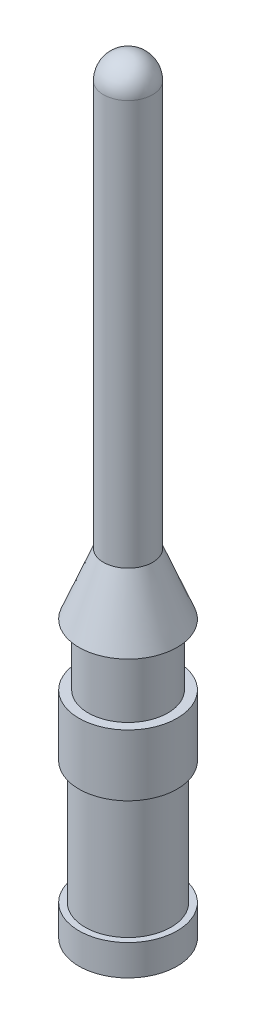
ISO-10303-21;
HEADER;
FILE_DESCRIPTION(('STEP AP214'),'2;1');
FILE_NAME('part.step','',(''),(''),'','','');
FILE_SCHEMA(('AUTOMOTIVE_DESIGN { 1 0 10303 214 1 1 1 1 }'));
ENDSEC;
DATA;
#1=APPLICATION_CONTEXT('core data for automotive mechanical design processes');
#2=APPLICATION_PROTOCOL_DEFINITION('international standard','automotive_design',2000,#1);
#3=PRODUCT_CONTEXT('',#1,'mechanical');
#4=PRODUCT('Part','Part','',(#3));
#5=PRODUCT_RELATED_PRODUCT_CATEGORY('part','',(#4));
#6=PRODUCT_DEFINITION_FORMATION('','',#4);
#7=PRODUCT_DEFINITION_CONTEXT('part definition',#1,'design');
#8=PRODUCT_DEFINITION('design','',#6,#7);
#9=PRODUCT_DEFINITION_SHAPE('','',#8);
#10=(LENGTH_UNIT() NAMED_UNIT(*) SI_UNIT(.MILLI.,.METRE.));
#11=(NAMED_UNIT(*) PLANE_ANGLE_UNIT() SI_UNIT($,.RADIAN.));
#12=(NAMED_UNIT(*) SI_UNIT($,.STERADIAN.) SOLID_ANGLE_UNIT());
#13=UNCERTAINTY_MEASURE_WITH_UNIT(LENGTH_MEASURE(1.E-05),#10,'distance_accuracy_value','');
#14=(GEOMETRIC_REPRESENTATION_CONTEXT(3) GLOBAL_UNCERTAINTY_ASSIGNED_CONTEXT((#13)) GLOBAL_UNIT_ASSIGNED_CONTEXT((#10,
#11,#12)) REPRESENTATION_CONTEXT('',''));
#15=CARTESIAN_POINT('',(0.,0.,0.));
#16=DIRECTION('',(0.,0.,1.));
#17=DIRECTION('',(1.,0.,0.));
#18=AXIS2_PLACEMENT_3D('',#15,#16,#17);
#19=CARTESIAN_POINT('',(0.7975,8.,-0.79750000000016));
#20=DIRECTION('',(0.,-1.,0.));
#21=DIRECTION('',(0.,0.,1.));
#22=AXIS2_PLACEMENT_3D('',#19,#20,#21);
#23=PLANE('',#22);
#24=CARTESIAN_POINT('',(-1.48401715777933E-13,8.00000000000001,0.));
#25=DIRECTION('',(0.,1.,0.));
#26=DIRECTION('',(-1.,0.,0.));
#27=AXIS2_PLACEMENT_3D('',#24,#25,#26);
#28=CIRCLE('',#27,0.725000000000306);
#29=CARTESIAN_POINT('',(-0.725000000000454,8.,0.));
#30=VERTEX_POINT('',#29);
#31=EDGE_CURVE('E18',#30,#30,#28,.T.);
#32=ORIENTED_EDGE('',*,*,#31,.F.);
#33=EDGE_LOOP('',(#32));
#34=FACE_BOUND('',#33,.T.);
#35=ADVANCED_FACE('F14',(#34),#23,.T.);
#36=CARTESIAN_POINT('',(0.,0.,0.));
#37=DIRECTION('',(0.,1.,0.));
#38=DIRECTION('',(-1.,0.,0.));
#39=AXIS2_PLACEMENT_3D('',#36,#37,#38);
#40=CYLINDRICAL_SURFACE('',#39,0.725000000000306);
#41=CARTESIAN_POINT('',(0.,0.,0.));
#42=DIRECTION('',(0.,1.,0.));
#43=DIRECTION('',(-1.,0.,0.));
#44=AXIS2_PLACEMENT_3D('',#41,#42,#43);
#45=CIRCLE('',#44,0.725000000000306);
#46=CARTESIAN_POINT('',(-0.725000000000295,0.,0.));
#47=VERTEX_POINT('',#46);
#48=EDGE_CURVE('E55',#47,#47,#45,.T.);
#49=ORIENTED_EDGE('',*,*,#48,.F.);
#50=EDGE_LOOP('',(#49));
#51=FACE_BOUND('',#50,.T.);
#52=ORIENTED_EDGE('',*,*,#31,.T.);
#53=EDGE_LOOP('',(#52));
#54=FACE_BOUND('',#53,.T.);
#55=ADVANCED_FACE('F62',(#51,#54),#40,.F.);
#56=CARTESIAN_POINT('',(1.76,0.,-1.76));
#57=DIRECTION('',(0.,-1.,0.));
#58=DIRECTION('',(0.,0.,1.));
#59=AXIS2_PLACEMENT_3D('',#56,#57,#58);
#60=PLANE('',#59);
#61=ORIENTED_EDGE('',*,*,#48,.T.);
#62=EDGE_LOOP('',(#61));
#63=FACE_BOUND('',#62,.T.);
#64=CARTESIAN_POINT('',(0.,0.,0.));
#65=DIRECTION('',(0.,-1.,0.));
#66=DIRECTION('',(0.,0.,-1.));
#67=AXIS2_PLACEMENT_3D('',#64,#65,#66);
#68=CIRCLE('',#67,1.59999999999999);
#69=CARTESIAN_POINT('',(0.,0.,-1.59999999999999));
#70=VERTEX_POINT('',#69);
#71=EDGE_CURVE('E53',#70,#70,#68,.F.);
#72=ORIENTED_EDGE('',*,*,#71,.F.);
#73=EDGE_LOOP('',(#72));
#74=FACE_BOUND('',#73,.T.);
#75=ADVANCED_FACE('F70',(#63,#74),#60,.T.);
#76=CARTESIAN_POINT('',(0.,1.,0.));
#77=DIRECTION('',(0.,-1.,0.));
#78=DIRECTION('',(0.,0.,-1.));
#79=AXIS2_PLACEMENT_3D('',#76,#77,#78);
#80=CYLINDRICAL_SURFACE('',#79,1.59999999999999);
#81=CARTESIAN_POINT('',(0.,1.,0.));
#82=DIRECTION('',(0.,-1.,0.));
#83=DIRECTION('',(0.,0.,-1.));
#84=AXIS2_PLACEMENT_3D('',#81,#82,#83);
#85=CIRCLE('',#84,1.59999999999999);
#86=CARTESIAN_POINT('',(0.,1.,-1.59999999999999));
#87=VERTEX_POINT('',#86);
#88=EDGE_CURVE('E50',#87,#87,#85,.F.);
#89=ORIENTED_EDGE('',*,*,#88,.F.);
#90=EDGE_LOOP('',(#89));
#91=FACE_BOUND('',#90,.T.);
#92=ORIENTED_EDGE('',*,*,#71,.T.);
#93=EDGE_LOOP('',(#92));
#94=FACE_BOUND('',#93,.T.);
#95=ADVANCED_FACE('F115',(#91,#94),#80,.T.);
#96=CARTESIAN_POINT('',(-1.76,1.,-1.76));
#97=DIRECTION('',(0.,1.,0.));
#98=DIRECTION('',(0.,0.,1.));
#99=AXIS2_PLACEMENT_3D('',#96,#97,#98);
#100=PLANE('',#99);
#101=CARTESIAN_POINT('',(-1.00830802041152E-13,1.,0.));
#102=DIRECTION('',(0.,-1.,0.));
#103=DIRECTION('',(0.,0.,-1.));
#104=AXIS2_PLACEMENT_3D('',#101,#102,#103);
#105=CIRCLE('',#104,1.40000000000021);
#106=CARTESIAN_POINT('',(-1.00830802041152E-13,1.,-1.40000000000021));
#107=VERTEX_POINT('',#106);
#108=EDGE_CURVE('E47',#107,#107,#105,.F.);
#109=ORIENTED_EDGE('',*,*,#108,.F.);
#110=EDGE_LOOP('',(#109));
#111=FACE_BOUND('',#110,.T.);
#112=ORIENTED_EDGE('',*,*,#88,.T.);
#113=EDGE_LOOP('',(#112));
#114=FACE_BOUND('',#113,.T.);
#115=ADVANCED_FACE('F111',(#111,#114),#100,.T.);
#116=CARTESIAN_POINT('',(-1.00830802041152E-13,5.,0.));
#117=DIRECTION('',(0.,-1.,0.));
#118=DIRECTION('',(0.,0.,-1.));
#119=AXIS2_PLACEMENT_3D('',#116,#117,#118);
#120=CYLINDRICAL_SURFACE('',#119,1.40000000000021);
#121=CARTESIAN_POINT('',(-1.00830802041152E-13,5.,0.));
#122=DIRECTION('',(0.,-1.,0.));
#123=DIRECTION('',(0.,0.,-1.));
#124=AXIS2_PLACEMENT_3D('',#121,#122,#123);
#125=CIRCLE('',#124,1.40000000000021);
#126=CARTESIAN_POINT('',(-1.00830802041152E-13,5.,-1.40000000000021));
#127=VERTEX_POINT('',#126);
#128=EDGE_CURVE('E44',#127,#127,#125,.F.);
#129=ORIENTED_EDGE('',*,*,#128,.F.);
#130=EDGE_LOOP('',(#129));
#131=FACE_BOUND('',#130,.T.);
#132=ORIENTED_EDGE('',*,*,#108,.T.);
#133=EDGE_LOOP('',(#132));
#134=FACE_BOUND('',#133,.T.);
#135=ADVANCED_FACE('F107',(#131,#134),#120,.T.);
#136=CARTESIAN_POINT('',(1.7599999999998,5.,-1.7599999999999));
#137=DIRECTION('',(0.,-1.,0.));
#138=DIRECTION('',(0.,0.,1.));
#139=AXIS2_PLACEMENT_3D('',#136,#137,#138);
#140=PLANE('',#139);
#141=ORIENTED_EDGE('',*,*,#128,.T.);
#142=EDGE_LOOP('',(#141));
#143=FACE_BOUND('',#142,.T.);
#144=CARTESIAN_POINT('',(0.,5.00000000000007,0.));
#145=DIRECTION('',(0.,-1.,0.));
#146=DIRECTION('',(1.,0.,0.));
#147=AXIS2_PLACEMENT_3D('',#144,#145,#146);
#148=CIRCLE('',#147,1.59999999999986);
#149=CARTESIAN_POINT('',(1.59999999999978,5.00000000000013,0.));
#150=VERTEX_POINT('',#149);
#151=EDGE_CURVE('E41',#150,#150,#148,.F.);
#152=ORIENTED_EDGE('',*,*,#151,.F.);
#153=EDGE_LOOP('',(#152));
#154=FACE_BOUND('',#153,.T.);
#155=ADVANCED_FACE('F103',(#143,#154),#140,.T.);
#156=CARTESIAN_POINT('',(-1.62413485438329E-13,7.00000000000007,0.));
#157=DIRECTION('',(0.,-1.,0.));
#158=DIRECTION('',(1.,0.,0.));
#159=AXIS2_PLACEMENT_3D('',#156,#157,#158);
#160=CYLINDRICAL_SURFACE('',#159,1.59999999999986);
#161=CARTESIAN_POINT('',(-1.62413485438329E-13,7.00000000000007,0.));
#162=DIRECTION('',(0.,-1.,0.));
#163=DIRECTION('',(1.,0.,0.));
#164=AXIS2_PLACEMENT_3D('',#161,#162,#163);
#165=CIRCLE('',#164,1.59999999999986);
#166=CARTESIAN_POINT('',(1.5999999999997,7.00000000000013,0.));
#167=VERTEX_POINT('',#166);
#168=EDGE_CURVE('E38',#167,#167,#165,.F.);
#169=ORIENTED_EDGE('',*,*,#168,.F.);
#170=EDGE_LOOP('',(#169));
#171=FACE_BOUND('',#170,.T.);
#172=ORIENTED_EDGE('',*,*,#151,.T.);
#173=EDGE_LOOP('',(#172));
#174=FACE_BOUND('',#173,.T.);
#175=ADVANCED_FACE('F99',(#171,#174),#160,.T.);
#176=CARTESIAN_POINT('',(-1.76,7.,-1.7599999999998));
#177=DIRECTION('',(0.,1.,0.));
#178=DIRECTION('',(0.,0.,1.));
#179=AXIS2_PLACEMENT_3D('',#176,#177,#178);
#180=PLANE('',#179);
#181=CARTESIAN_POINT('',(-2.09413649615575E-13,7.,0.));
#182=DIRECTION('',(0.,-1.,0.));
#183=DIRECTION('',(0.,0.,-1.));
#184=AXIS2_PLACEMENT_3D('',#181,#182,#183);
#185=CIRCLE('',#184,1.30000000000012);
#186=CARTESIAN_POINT('',(-2.09413649615575E-13,7.,-1.30000000000013));
#187=VERTEX_POINT('',#186);
#188=EDGE_CURVE('E35',#187,#187,#185,.F.);
#189=ORIENTED_EDGE('',*,*,#188,.F.);
#190=EDGE_LOOP('',(#189));
#191=FACE_BOUND('',#190,.T.);
#192=ORIENTED_EDGE('',*,*,#168,.T.);
#193=EDGE_LOOP('',(#192));
#194=FACE_BOUND('',#193,.T.);
#195=ADVANCED_FACE('F95',(#191,#194),#180,.T.);
#196=CARTESIAN_POINT('',(-2.09413649615575E-13,9.,0.));
#197=DIRECTION('',(0.,-1.,0.));
#198=DIRECTION('',(0.,0.,-1.));
#199=AXIS2_PLACEMENT_3D('',#196,#197,#198);
#200=CYLINDRICAL_SURFACE('',#199,1.30000000000012);
#201=CARTESIAN_POINT('',(-2.09413649615575E-13,9.,0.));
#202=DIRECTION('',(0.,-1.,0.));
#203=DIRECTION('',(0.,0.,-1.));
#204=AXIS2_PLACEMENT_3D('',#201,#202,#203);
#205=CIRCLE('',#204,1.30000000000012);
#206=CARTESIAN_POINT('',(-2.09413649615575E-13,9.,-1.30000000000013));
#207=VERTEX_POINT('',#206);
#208=EDGE_CURVE('E32',#207,#207,#205,.F.);
#209=ORIENTED_EDGE('',*,*,#208,.F.);
#210=EDGE_LOOP('',(#209));
#211=FACE_BOUND('',#210,.T.);
#212=ORIENTED_EDGE('',*,*,#188,.T.);
#213=EDGE_LOOP('',(#212));
#214=FACE_BOUND('',#213,.T.);
#215=ADVANCED_FACE('F89',(#211,#214),#200,.T.);
#216=CARTESIAN_POINT('',(1.7599999999998,9.,-1.76));
#217=DIRECTION('',(0.,-1.,0.));
#218=DIRECTION('',(0.,0.,1.));
#219=AXIS2_PLACEMENT_3D('',#216,#217,#218);
#220=PLANE('',#219);
#221=ORIENTED_EDGE('',*,*,#208,.T.);
#222=EDGE_LOOP('',(#221));
#223=FACE_BOUND('',#222,.T.);
#224=CARTESIAN_POINT('',(-2.19821990471436E-13,9.,0.));
#225=DIRECTION('',(0.,-1.,0.));
#226=DIRECTION('',(0.,0.,-1.));
#227=AXIS2_PLACEMENT_3D('',#224,#225,#226);
#228=CIRCLE('',#227,1.59999999999998);
#229=CARTESIAN_POINT('',(-2.19821990471436E-13,9.,-1.59999999999998));
#230=VERTEX_POINT('',#229);
#231=EDGE_CURVE('E27',#230,#230,#228,.F.);
#232=ORIENTED_EDGE('',*,*,#231,.F.);
#233=EDGE_LOOP('',(#232));
#234=FACE_BOUND('',#233,.T.);
#235=ADVANCED_FACE('F84',(#223,#234),#220,.T.);
#236=CARTESIAN_POINT('',(-8.59555462247219E-13,24.1999999999998,0.));
#237=DIRECTION('',(2.65990932983518E-13,-1.,4.60709810280097E-13));
#238=DIRECTION('',(1.,2.65990932983517E-13,0.));
#239=AXIS2_PLACEMENT_3D('',#236,#237,#238);
#240=SPHERICAL_SURFACE('',#239,0.799999999999923);
#241=CARTESIAN_POINT('',(-4.87728347292604E-13,24.2000000000007,0.));
#242=DIRECTION('',(-4.17779237131179E-13,-1.,-7.23614865058567E-13));
#243=DIRECTION('',(0.,7.23614865058567E-13,-1.));
#244=AXIS2_PLACEMENT_3D('',#241,#242,#243);
#245=CIRCLE('',#244,0.799999999999814);
#246=CARTESIAN_POINT('',(-4.87728347292604E-13,24.2000000000012,-0.799999999999814));
#247=VERTEX_POINT('',#246);
#248=EDGE_CURVE('E22',#247,#247,#245,.T.);
#249=ORIENTED_EDGE('',*,*,#248,.F.);
#250=EDGE_LOOP('',(#249));
#251=FACE_BOUND('',#250,.T.);
#252=ADVANCED_FACE('F79',(#251),#240,.T.);
#253=CARTESIAN_POINT('',(-2.19821990471436E-13,11.,0.));
#254=DIRECTION('',(0.,-1.,0.));
#255=DIRECTION('',(0.,0.,-1.));
#256=AXIS2_PLACEMENT_3D('',#253,#254,#255);
#257=CONICAL_SURFACE('',#256,0.80000000000008,0.380506377112322);
#258=CARTESIAN_POINT('',(-2.19821990471436E-13,11.,0.));
#259=DIRECTION('',(0.,1.,0.));
#260=DIRECTION('',(0.,0.,1.));
#261=AXIS2_PLACEMENT_3D('',#258,#259,#260);
#262=CIRCLE('',#261,0.80000000000008);
#263=CARTESIAN_POINT('',(-2.19821990471436E-13,11.,0.80000000000008));
#264=VERTEX_POINT('',#263);
#265=EDGE_CURVE('E10',#264,#264,#262,.T.);
#266=ORIENTED_EDGE('',*,*,#265,.F.);
#267=EDGE_LOOP('',(#266));
#268=FACE_BOUND('',#267,.T.);
#269=ORIENTED_EDGE('',*,*,#231,.T.);
#270=EDGE_LOOP('',(#269));
#271=FACE_BOUND('',#270,.T.);
#272=ADVANCED_FACE('F74',(#268,#271),#257,.T.);
#273=CARTESIAN_POINT('',(-4.87728347292604E-13,24.2000000000007,0.));
#274=DIRECTION('',(-4.17779237131179E-13,-1.,-7.23614865058567E-13));
#275=DIRECTION('',(0.,7.23614865058567E-13,-1.));
#276=AXIS2_PLACEMENT_3D('',#273,#274,#275);
#277=CYLINDRICAL_SURFACE('',#276,0.799999999999814);
#278=ORIENTED_EDGE('',*,*,#248,.T.);
#279=EDGE_LOOP('',(#278));
#280=FACE_BOUND('',#279,.T.);
#281=ORIENTED_EDGE('',*,*,#265,.T.);
#282=EDGE_LOOP('',(#281));
#283=FACE_BOUND('',#282,.T.);
#284=ADVANCED_FACE('F16',(#280,#283),#277,.T.);
#285=CLOSED_SHELL('',(#35,#55,#75,#95,#115,#135,#155,#175,#195,#215,#235,#252,#272,#284));
#286=MANIFOLD_SOLID_BREP('B1',#285);
#287=ADVANCED_BREP_SHAPE_REPRESENTATION('',(#18,#286),#14);
#288=SHAPE_DEFINITION_REPRESENTATION(#9,#287);
ENDSEC;
END-ISO-10303-21;
